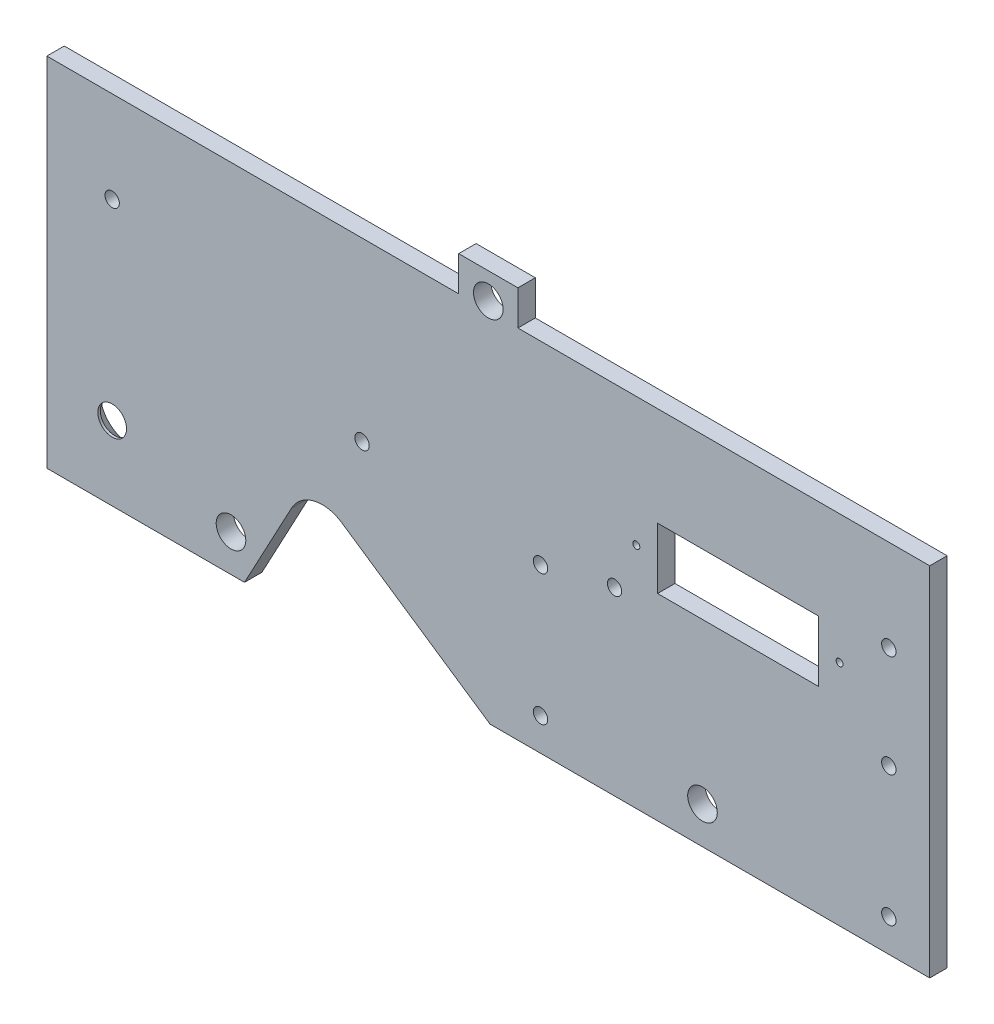
ISO-10303-21;
HEADER;
FILE_DESCRIPTION(('STEP AP214'),'2;1');
FILE_NAME('part.step','',(''),(''),'','','');
FILE_SCHEMA(('AUTOMOTIVE_DESIGN { 1 0 10303 214 1 1 1 1 }'));
ENDSEC;
DATA;
#1=APPLICATION_CONTEXT('core data for automotive mechanical design processes');
#2=APPLICATION_PROTOCOL_DEFINITION('international standard','automotive_design',2000,#1);
#3=PRODUCT_CONTEXT('',#1,'mechanical');
#4=PRODUCT('Part','Part','',(#3));
#5=PRODUCT_RELATED_PRODUCT_CATEGORY('part','',(#4));
#6=PRODUCT_DEFINITION_FORMATION('','',#4);
#7=PRODUCT_DEFINITION_CONTEXT('part definition',#1,'design');
#8=PRODUCT_DEFINITION('design','',#6,#7);
#9=PRODUCT_DEFINITION_SHAPE('','',#8);
#10=(LENGTH_UNIT() NAMED_UNIT(*) SI_UNIT(.MILLI.,.METRE.));
#11=(NAMED_UNIT(*) PLANE_ANGLE_UNIT() SI_UNIT($,.RADIAN.));
#12=(NAMED_UNIT(*) SI_UNIT($,.STERADIAN.) SOLID_ANGLE_UNIT());
#13=UNCERTAINTY_MEASURE_WITH_UNIT(LENGTH_MEASURE(1.E-05),#10,'distance_accuracy_value','');
#14=(GEOMETRIC_REPRESENTATION_CONTEXT(3) GLOBAL_UNCERTAINTY_ASSIGNED_CONTEXT((#13)) GLOBAL_UNIT_ASSIGNED_CONTEXT((#10,
#11,#12)) REPRESENTATION_CONTEXT('',''));
#15=CARTESIAN_POINT('',(0.,0.,0.));
#16=DIRECTION('',(0.,0.,1.));
#17=DIRECTION('',(1.,0.,0.));
#18=AXIS2_PLACEMENT_3D('',#15,#16,#17);
#19=CARTESIAN_POINT('',(-101.4,-41.,-4.));
#20=DIRECTION('',(0.,0.,1.));
#21=DIRECTION('',(1.,0.,0.));
#22=AXIS2_PLACEMENT_3D('',#19,#20,#21);
#23=PLANE('',#22);
#24=CARTESIAN_POINT('',(-86.4,-24.,-4.));
#25=DIRECTION('',(0.,0.,-1.));
#26=DIRECTION('',(-1.,0.,0.));
#27=AXIS2_PLACEMENT_3D('',#24,#25,#26);
#28=CIRCLE('',#27,6.72);
#29=CARTESIAN_POINT('',(-93.12,-24.,-4.));
#30=VERTEX_POINT('',#29);
#31=EDGE_CURVE('E262',#30,#30,#28,.T.);
#32=ORIENTED_EDGE('',*,*,#31,.F.);
#33=EDGE_LOOP('',(#32));
#34=FACE_BOUND('',#33,.T.);
#35=DIRECTION('',(-1.,0.,0.));
#36=VECTOR('',#35,1.);
#37=CARTESIAN_POINT('',(75.8845778593409,18.2267991929112,-4.));
#38=LINE('',#37,#36);
#39=CARTESIAN_POINT('',(75.8845778593409,18.2267991929112,-4.));
#40=VERTEX_POINT('',#39);
#41=CARTESIAN_POINT('',(38.8845778593409,18.2267991929112,-4.));
#42=VERTEX_POINT('',#41);
#43=EDGE_CURVE('E312',#40,#42,#38,.T.);
#44=ORIENTED_EDGE('',*,*,#43,.T.);
#45=DIRECTION('',(0.,-1.,0.));
#46=VECTOR('',#45,1.);
#47=CARTESIAN_POINT('',(38.8845778593409,4.22679919291115,-4.));
#48=LINE('',#47,#46);
#49=CARTESIAN_POINT('',(38.8845778593409,4.22679919291115,-4.));
#50=VERTEX_POINT('',#49);
#51=EDGE_CURVE('E299',#42,#50,#48,.T.);
#52=ORIENTED_EDGE('',*,*,#51,.T.);
#53=DIRECTION('',(1.,0.,0.));
#54=VECTOR('',#53,1.);
#55=CARTESIAN_POINT('',(75.8845778593409,4.22679919291116,-4.));
#56=LINE('',#55,#54);
#57=CARTESIAN_POINT('',(75.8845778593409,4.22679919291115,-4.));
#58=VERTEX_POINT('',#57);
#59=EDGE_CURVE('E303',#50,#58,#56,.T.);
#60=ORIENTED_EDGE('',*,*,#59,.T.);
#61=DIRECTION('',(0.,1.,0.));
#62=VECTOR('',#61,1.);
#63=CARTESIAN_POINT('',(75.8845778593409,4.22679919291116,-4.));
#64=LINE('',#63,#62);
#65=EDGE_CURVE('E308',#58,#40,#64,.T.);
#66=ORIENTED_EDGE('',*,*,#65,.T.);
#67=EDGE_LOOP('',(#44,#52,#60,#66));
#68=FACE_BOUND('',#67,.T.);
#69=CARTESIAN_POINT('',(34.,11.4,-4.));
#70=DIRECTION('',(0.,0.,1.));
#71=DIRECTION('',(1.,0.,0.));
#72=AXIS2_PLACEMENT_3D('',#69,#70,#71);
#73=CIRCLE('',#72,0.800000000000002);
#74=CARTESIAN_POINT('',(34.8,11.4,-4.));
#75=VERTEX_POINT('',#74);
#76=EDGE_CURVE('E345',#75,#75,#73,.T.);
#77=ORIENTED_EDGE('',*,*,#76,.T.);
#78=EDGE_LOOP('',(#77));
#79=FACE_BOUND('',#78,.T.);
#80=CARTESIAN_POINT('',(80.7,11.4,-4.));
#81=DIRECTION('',(0.,0.,1.));
#82=DIRECTION('',(1.,0.,0.));
#83=AXIS2_PLACEMENT_3D('',#80,#81,#82);
#84=CIRCLE('',#83,0.799999999999995);
#85=CARTESIAN_POINT('',(81.5,11.4,-4.));
#86=VERTEX_POINT('',#85);
#87=EDGE_CURVE('E353',#86,#86,#84,.T.);
#88=ORIENTED_EDGE('',*,*,#87,.T.);
#89=EDGE_LOOP('',(#88));
#90=FACE_BOUND('',#89,.T.);
#91=CARTESIAN_POINT('',(-59.1,-32.5,-4.));
#92=DIRECTION('',(0.,0.,1.));
#93=DIRECTION('',(1.,0.,0.));
#94=AXIS2_PLACEMENT_3D('',#91,#92,#93);
#95=CIRCLE('',#94,3.4);
#96=CARTESIAN_POINT('',(-55.7,-32.5,-4.));
#97=VERTEX_POINT('',#96);
#98=EDGE_CURVE('E361',#97,#97,#95,.T.);
#99=ORIENTED_EDGE('',*,*,#98,.T.);
#100=EDGE_LOOP('',(#99));
#101=FACE_BOUND('',#100,.T.);
#102=CARTESIAN_POINT('',(49.2,-32.5,-4.));
#103=DIRECTION('',(0.,0.,1.));
#104=DIRECTION('',(1.,0.,0.));
#105=AXIS2_PLACEMENT_3D('',#102,#103,#104);
#106=CIRCLE('',#105,3.4);
#107=CARTESIAN_POINT('',(52.6,-32.5,-4.));
#108=VERTEX_POINT('',#107);
#109=EDGE_CURVE('E369',#108,#108,#106,.T.);
#110=ORIENTED_EDGE('',*,*,#109,.T.);
#111=EDGE_LOOP('',(#110));
#112=FACE_BOUND('',#111,.T.);
#113=CARTESIAN_POINT('',(0.,43.,-4.));
#114=DIRECTION('',(0.,0.,1.));
#115=DIRECTION('',(1.,0.,0.));
#116=AXIS2_PLACEMENT_3D('',#113,#114,#115);
#117=CIRCLE('',#116,3.4);
#118=CARTESIAN_POINT('',(3.4,43.,-4.));
#119=VERTEX_POINT('',#118);
#120=EDGE_CURVE('E377',#119,#119,#117,.T.);
#121=ORIENTED_EDGE('',*,*,#120,.T.);
#122=EDGE_LOOP('',(#121));
#123=FACE_BOUND('',#122,.T.);
#124=CARTESIAN_POINT('',(12.,-3.5,-4.));
#125=DIRECTION('',(0.,0.,1.));
#126=DIRECTION('',(1.,0.,0.));
#127=AXIS2_PLACEMENT_3D('',#124,#125,#126);
#128=CIRCLE('',#127,1.65);
#129=CARTESIAN_POINT('',(13.65,-3.5,-4.));
#130=VERTEX_POINT('',#129);
#131=EDGE_CURVE('E258',#130,#130,#128,.T.);
#132=ORIENTED_EDGE('',*,*,#131,.T.);
#133=EDGE_LOOP('',(#132));
#134=FACE_BOUND('',#133,.T.);
#135=CARTESIAN_POINT('',(92.,-3.5,-4.));
#136=DIRECTION('',(0.,0.,1.));
#137=DIRECTION('',(1.,0.,0.));
#138=AXIS2_PLACEMENT_3D('',#135,#136,#137);
#139=CIRCLE('',#138,1.65);
#140=CARTESIAN_POINT('',(93.65,-3.5,-4.));
#141=VERTEX_POINT('',#140);
#142=EDGE_CURVE('E250',#141,#141,#139,.T.);
#143=ORIENTED_EDGE('',*,*,#142,.T.);
#144=EDGE_LOOP('',(#143));
#145=FACE_BOUND('',#144,.T.);
#146=CARTESIAN_POINT('',(12.,-33.5,-4.));
#147=DIRECTION('',(0.,0.,1.));
#148=DIRECTION('',(1.,0.,0.));
#149=AXIS2_PLACEMENT_3D('',#146,#147,#148);
#150=CIRCLE('',#149,1.65);
#151=CARTESIAN_POINT('',(13.65,-33.5,-4.));
#152=VERTEX_POINT('',#151);
#153=EDGE_CURVE('E242',#152,#152,#150,.T.);
#154=ORIENTED_EDGE('',*,*,#153,.T.);
#155=EDGE_LOOP('',(#154));
#156=FACE_BOUND('',#155,.T.);
#157=CARTESIAN_POINT('',(92.,-33.5,-4.));
#158=DIRECTION('',(0.,0.,1.));
#159=DIRECTION('',(1.,0.,0.));
#160=AXIS2_PLACEMENT_3D('',#157,#158,#159);
#161=CIRCLE('',#160,1.65);
#162=CARTESIAN_POINT('',(93.65,-33.5,-4.));
#163=VERTEX_POINT('',#162);
#164=EDGE_CURVE('E234',#163,#163,#161,.T.);
#165=ORIENTED_EDGE('',*,*,#164,.T.);
#166=EDGE_LOOP('',(#165));
#167=FACE_BOUND('',#166,.T.);
#168=CARTESIAN_POINT('',(-29.,0.5,-4.));
#169=DIRECTION('',(0.,0.,1.));
#170=DIRECTION('',(1.,0.,0.));
#171=AXIS2_PLACEMENT_3D('',#168,#169,#170);
#172=CIRCLE('',#171,1.65);
#173=CARTESIAN_POINT('',(-27.35,0.5,-4.));
#174=VERTEX_POINT('',#173);
#175=EDGE_CURVE('E226',#174,#174,#172,.T.);
#176=ORIENTED_EDGE('',*,*,#175,.T.);
#177=EDGE_LOOP('',(#176));
#178=FACE_BOUND('',#177,.T.);
#179=CARTESIAN_POINT('',(-86.4,20.,-4.));
#180=DIRECTION('',(0.,0.,1.));
#181=DIRECTION('',(1.,0.,0.));
#182=AXIS2_PLACEMENT_3D('',#179,#180,#181);
#183=CIRCLE('',#182,1.65);
#184=CARTESIAN_POINT('',(-84.75,20.,-4.));
#185=VERTEX_POINT('',#184);
#186=EDGE_CURVE('E218',#185,#185,#183,.T.);
#187=ORIENTED_EDGE('',*,*,#186,.T.);
#188=EDGE_LOOP('',(#187));
#189=FACE_BOUND('',#188,.T.);
#190=CARTESIAN_POINT('',(92.,20.,-4.));
#191=DIRECTION('',(0.,0.,1.));
#192=DIRECTION('',(1.,0.,0.));
#193=AXIS2_PLACEMENT_3D('',#190,#191,#192);
#194=CIRCLE('',#193,1.65);
#195=CARTESIAN_POINT('',(93.65,20.,-4.));
#196=VERTEX_POINT('',#195);
#197=EDGE_CURVE('E210',#196,#196,#194,.T.);
#198=ORIENTED_EDGE('',*,*,#197,.T.);
#199=EDGE_LOOP('',(#198));
#200=FACE_BOUND('',#199,.T.);
#201=CARTESIAN_POINT('',(29.,0.5,-4.));
#202=DIRECTION('',(0.,0.,1.));
#203=DIRECTION('',(1.,0.,0.));
#204=AXIS2_PLACEMENT_3D('',#201,#202,#203);
#205=CIRCLE('',#204,1.65);
#206=CARTESIAN_POINT('',(30.65,0.5,-4.));
#207=VERTEX_POINT('',#206);
#208=EDGE_CURVE('E202',#207,#207,#205,.T.);
#209=ORIENTED_EDGE('',*,*,#208,.T.);
#210=EDGE_LOOP('',(#209));
#211=FACE_BOUND('',#210,.T.);
#212=DIRECTION('',(0.,1.,0.));
#213=VECTOR('',#212,1.);
#214=CARTESIAN_POINT('',(6.80000000000001,-41.,-4.));
#215=LINE('',#214,#213);
#216=CARTESIAN_POINT('',(6.8,41.,-4.));
#217=VERTEX_POINT('',#216);
#218=CARTESIAN_POINT('',(6.8,49.,-4.));
#219=VERTEX_POINT('',#218);
#220=EDGE_CURVE('E161',#217,#219,#215,.T.);
#221=ORIENTED_EDGE('',*,*,#220,.F.);
#222=DIRECTION('',(-1.,0.,0.));
#223=VECTOR('',#222,1.);
#224=CARTESIAN_POINT('',(-101.4,41.,-4.));
#225=LINE('',#224,#223);
#226=CARTESIAN_POINT('',(101.4,41.,-4.));
#227=VERTEX_POINT('',#226);
#228=EDGE_CURVE('E162',#227,#217,#225,.T.);
#229=ORIENTED_EDGE('',*,*,#228,.F.);
#230=DIRECTION('',(0.,1.,0.));
#231=VECTOR('',#230,1.);
#232=CARTESIAN_POINT('',(101.4,49.,-4.));
#233=LINE('',#232,#231);
#234=CARTESIAN_POINT('',(101.4,-41.,-4.));
#235=VERTEX_POINT('',#234);
#236=EDGE_CURVE('E391',#235,#227,#233,.T.);
#237=ORIENTED_EDGE('',*,*,#236,.F.);
#238=DIRECTION('',(1.,0.,0.));
#239=VECTOR('',#238,1.);
#240=CARTESIAN_POINT('',(-101.4,-41.,-4.));
#241=LINE('',#240,#239);
#242=CARTESIAN_POINT('',(0.400000000000005,-41.,-4.));
#243=VERTEX_POINT('',#242);
#244=EDGE_CURVE('E385',#243,#235,#241,.T.);
#245=ORIENTED_EDGE('',*,*,#244,.F.);
#246=DIRECTION('',(-0.828338030888977,0.560228619924912,0.));
#247=VECTOR('',#246,1.);
#248=CARTESIAN_POINT('',(-69.4494483498535,6.24117279700235,-4.));
#249=LINE('',#248,#247);
#250=CARTESIAN_POINT('',(-33.6541024444562,-17.9682398926383,-4.));
#251=VERTEX_POINT('',#250);
#252=EDGE_CURVE('E289',#243,#251,#249,.T.);
#253=ORIENTED_EDGE('',*,*,#252,.T.);
#254=CARTESIAN_POINT('',(-38.1359314038555,-24.5949441397501,-4.));
#255=DIRECTION('',(0.,0.,1.));
#256=DIRECTION('',(1.,0.,0.));
#257=AXIS2_PLACEMENT_3D('',#254,#255,#256);
#258=CIRCLE('',#257,8.);
#259=CARTESIAN_POINT('',(-45.1877711640858,-20.8171728396268,-4.));
#260=VERTEX_POINT('',#259);
#261=EDGE_CURVE('E292',#251,#260,#258,.T.);
#262=ORIENTED_EDGE('',*,*,#261,.T.);
#263=DIRECTION('',(-0.472221412515419,-0.881479970028782,0.));
#264=VECTOR('',#263,1.);
#265=CARTESIAN_POINT('',(-66.1238850346878,-59.8979187314172,-4.));
#266=LINE('',#265,#264);
#267=CARTESIAN_POINT('',(-56.,-41.,-4.));
#268=VERTEX_POINT('',#267);
#269=EDGE_CURVE('E295',#260,#268,#266,.T.);
#270=ORIENTED_EDGE('',*,*,#269,.T.);
#271=CARTESIAN_POINT('',(-101.4,-41.,-4.));
#272=VERTEX_POINT('',#271);
#273=EDGE_CURVE('E387',#272,#268,#241,.T.);
#274=ORIENTED_EDGE('',*,*,#273,.F.);
#275=DIRECTION('',(0.,-1.,0.));
#276=VECTOR('',#275,1.);
#277=CARTESIAN_POINT('',(-101.4,49.,-4.));
#278=LINE('',#277,#276);
#279=CARTESIAN_POINT('',(-101.4,41.,-4.));
#280=VERTEX_POINT('',#279);
#281=EDGE_CURVE('E382',#280,#272,#278,.T.);
#282=ORIENTED_EDGE('',*,*,#281,.F.);
#283=DIRECTION('',(1.,0.,0.));
#284=VECTOR('',#283,1.);
#285=CARTESIAN_POINT('',(-101.4,41.,-4.));
#286=LINE('',#285,#284);
#287=CARTESIAN_POINT('',(-6.8,41.,-4.));
#288=VERTEX_POINT('',#287);
#289=EDGE_CURVE('E61',#280,#288,#286,.T.);
#290=ORIENTED_EDGE('',*,*,#289,.T.);
#291=DIRECTION('',(0.,1.,0.));
#292=VECTOR('',#291,1.);
#293=CARTESIAN_POINT('',(-6.79999999999999,-41.,-4.));
#294=LINE('',#293,#292);
#295=CARTESIAN_POINT('',(-6.8,49.,-4.));
#296=VERTEX_POINT('',#295);
#297=EDGE_CURVE('E189',#288,#296,#294,.T.);
#298=ORIENTED_EDGE('',*,*,#297,.T.);
#299=DIRECTION('',(-1.,0.,0.));
#300=VECTOR('',#299,1.);
#301=CARTESIAN_POINT('',(-101.4,49.,-4.));
#302=LINE('',#301,#300);
#303=EDGE_CURVE('E395',#219,#296,#302,.T.);
#304=ORIENTED_EDGE('',*,*,#303,.F.);
#305=EDGE_LOOP('',(#221,#229,#237,#245,#253,#262,#270,#274,#282,#290,#298,#304));
#306=FACE_BOUND('',#305,.T.);
#307=ADVANCED_FACE('F37',(#34,#68,#79,#90,#101,#112,#123,#134,#145,#156,#167,#178,#189,#200,
#211,#306),#23,.F.);
#308=CARTESIAN_POINT('',(-101.4,-41.,0.));
#309=DIRECTION('',(0.,0.,1.));
#310=DIRECTION('',(1.,0.,0.));
#311=AXIS2_PLACEMENT_3D('',#308,#309,#310);
#312=PLANE('',#311);
#313=CARTESIAN_POINT('',(-86.4,-24.,0.));
#314=DIRECTION('',(0.,0.,-1.));
#315=DIRECTION('',(-1.,0.,0.));
#316=AXIS2_PLACEMENT_3D('',#313,#314,#315);
#317=CIRCLE('',#316,3.3);
#318=CARTESIAN_POINT('',(-89.7,-24.,0.));
#319=VERTEX_POINT('',#318);
#320=EDGE_CURVE('E270',#319,#319,#317,.T.);
#321=ORIENTED_EDGE('',*,*,#320,.T.);
#322=EDGE_LOOP('',(#321));
#323=FACE_BOUND('',#322,.T.);
#324=DIRECTION('',(0.,-1.,0.));
#325=VECTOR('',#324,1.);
#326=CARTESIAN_POINT('',(38.8845778593409,4.22679919291115,0.));
#327=LINE('',#326,#325);
#328=CARTESIAN_POINT('',(38.8845778593409,18.2267991929112,0.));
#329=VERTEX_POINT('',#328);
#330=CARTESIAN_POINT('',(38.8845778593409,4.22679919291115,0.));
#331=VERTEX_POINT('',#330);
#332=EDGE_CURVE('E298',#329,#331,#327,.T.);
#333=ORIENTED_EDGE('',*,*,#332,.F.);
#334=DIRECTION('',(-1.,0.,0.));
#335=VECTOR('',#334,1.);
#336=CARTESIAN_POINT('',(75.8845778593409,18.2267991929112,0.));
#337=LINE('',#336,#335);
#338=CARTESIAN_POINT('',(75.8845778593409,18.2267991929112,0.));
#339=VERTEX_POINT('',#338);
#340=EDGE_CURVE('E304',#339,#329,#337,.T.);
#341=ORIENTED_EDGE('',*,*,#340,.F.);
#342=DIRECTION('',(0.,1.,0.));
#343=VECTOR('',#342,1.);
#344=CARTESIAN_POINT('',(75.8845778593409,4.22679919291116,0.));
#345=LINE('',#344,#343);
#346=CARTESIAN_POINT('',(75.8845778593409,4.22679919291116,0.));
#347=VERTEX_POINT('',#346);
#348=EDGE_CURVE('E322',#347,#339,#345,.T.);
#349=ORIENTED_EDGE('',*,*,#348,.F.);
#350=DIRECTION('',(1.,0.,0.));
#351=VECTOR('',#350,1.);
#352=CARTESIAN_POINT('',(75.8845778593409,4.22679919291116,0.));
#353=LINE('',#352,#351);
#354=EDGE_CURVE('E318',#331,#347,#353,.T.);
#355=ORIENTED_EDGE('',*,*,#354,.F.);
#356=EDGE_LOOP('',(#333,#341,#349,#355));
#357=FACE_BOUND('',#356,.T.);
#358=CARTESIAN_POINT('',(34.,11.4,0.));
#359=DIRECTION('',(0.,0.,1.));
#360=DIRECTION('',(1.,0.,0.));
#361=AXIS2_PLACEMENT_3D('',#358,#359,#360);
#362=CIRCLE('',#361,0.799999999999995);
#363=CARTESIAN_POINT('',(34.8,11.4,0.));
#364=VERTEX_POINT('',#363);
#365=EDGE_CURVE('E332',#364,#364,#362,.T.);
#366=ORIENTED_EDGE('',*,*,#365,.F.);
#367=EDGE_LOOP('',(#366));
#368=FACE_BOUND('',#367,.T.);
#369=CARTESIAN_POINT('',(80.7,11.4,0.));
#370=DIRECTION('',(0.,0.,1.));
#371=DIRECTION('',(1.,0.,0.));
#372=AXIS2_PLACEMENT_3D('',#369,#370,#371);
#373=CIRCLE('',#372,0.799999999999995);
#374=CARTESIAN_POINT('',(81.5,11.4,0.));
#375=VERTEX_POINT('',#374);
#376=EDGE_CURVE('E349',#375,#375,#373,.T.);
#377=ORIENTED_EDGE('',*,*,#376,.F.);
#378=EDGE_LOOP('',(#377));
#379=FACE_BOUND('',#378,.T.);
#380=CARTESIAN_POINT('',(-59.1,-32.5,0.));
#381=DIRECTION('',(0.,0.,1.));
#382=DIRECTION('',(1.,0.,0.));
#383=AXIS2_PLACEMENT_3D('',#380,#381,#382);
#384=CIRCLE('',#383,3.39999999999999);
#385=CARTESIAN_POINT('',(-55.7,-32.5,0.));
#386=VERTEX_POINT('',#385);
#387=EDGE_CURVE('E357',#386,#386,#384,.T.);
#388=ORIENTED_EDGE('',*,*,#387,.F.);
#389=EDGE_LOOP('',(#388));
#390=FACE_BOUND('',#389,.T.);
#391=CARTESIAN_POINT('',(49.2,-32.5,0.));
#392=DIRECTION('',(0.,0.,1.));
#393=DIRECTION('',(1.,0.,0.));
#394=AXIS2_PLACEMENT_3D('',#391,#392,#393);
#395=CIRCLE('',#394,3.39999999999999);
#396=CARTESIAN_POINT('',(52.6,-32.5,0.));
#397=VERTEX_POINT('',#396);
#398=EDGE_CURVE('E365',#397,#397,#395,.T.);
#399=ORIENTED_EDGE('',*,*,#398,.F.);
#400=EDGE_LOOP('',(#399));
#401=FACE_BOUND('',#400,.T.);
#402=CARTESIAN_POINT('',(0.,43.,0.));
#403=DIRECTION('',(0.,0.,1.));
#404=DIRECTION('',(1.,0.,0.));
#405=AXIS2_PLACEMENT_3D('',#402,#403,#404);
#406=CIRCLE('',#405,3.4);
#407=CARTESIAN_POINT('',(3.4,43.,0.));
#408=VERTEX_POINT('',#407);
#409=EDGE_CURVE('E373',#408,#408,#406,.T.);
#410=ORIENTED_EDGE('',*,*,#409,.F.);
#411=EDGE_LOOP('',(#410));
#412=FACE_BOUND('',#411,.T.);
#413=CARTESIAN_POINT('',(12.,-3.5,0.));
#414=DIRECTION('',(0.,0.,1.));
#415=DIRECTION('',(1.,0.,0.));
#416=AXIS2_PLACEMENT_3D('',#413,#414,#415);
#417=CIRCLE('',#416,1.64999999999999);
#418=CARTESIAN_POINT('',(13.65,-3.5,0.));
#419=VERTEX_POINT('',#418);
#420=EDGE_CURVE('E254',#419,#419,#417,.T.);
#421=ORIENTED_EDGE('',*,*,#420,.F.);
#422=EDGE_LOOP('',(#421));
#423=FACE_BOUND('',#422,.T.);
#424=CARTESIAN_POINT('',(92.,-3.5,0.));
#425=DIRECTION('',(0.,0.,1.));
#426=DIRECTION('',(1.,0.,0.));
#427=AXIS2_PLACEMENT_3D('',#424,#425,#426);
#428=CIRCLE('',#427,1.64999999999998);
#429=CARTESIAN_POINT('',(93.65,-3.5,0.));
#430=VERTEX_POINT('',#429);
#431=EDGE_CURVE('E246',#430,#430,#428,.T.);
#432=ORIENTED_EDGE('',*,*,#431,.F.);
#433=EDGE_LOOP('',(#432));
#434=FACE_BOUND('',#433,.T.);
#435=CARTESIAN_POINT('',(12.,-33.5,0.));
#436=DIRECTION('',(0.,0.,1.));
#437=DIRECTION('',(1.,0.,0.));
#438=AXIS2_PLACEMENT_3D('',#435,#436,#437);
#439=CIRCLE('',#438,1.64999999999999);
#440=CARTESIAN_POINT('',(13.65,-33.5,0.));
#441=VERTEX_POINT('',#440);
#442=EDGE_CURVE('E238',#441,#441,#439,.T.);
#443=ORIENTED_EDGE('',*,*,#442,.F.);
#444=EDGE_LOOP('',(#443));
#445=FACE_BOUND('',#444,.T.);
#446=CARTESIAN_POINT('',(92.,-33.5,0.));
#447=DIRECTION('',(0.,0.,1.));
#448=DIRECTION('',(1.,0.,0.));
#449=AXIS2_PLACEMENT_3D('',#446,#447,#448);
#450=CIRCLE('',#449,1.64999999999998);
#451=CARTESIAN_POINT('',(93.65,-33.5,0.));
#452=VERTEX_POINT('',#451);
#453=EDGE_CURVE('E230',#452,#452,#450,.T.);
#454=ORIENTED_EDGE('',*,*,#453,.F.);
#455=EDGE_LOOP('',(#454));
#456=FACE_BOUND('',#455,.T.);
#457=CARTESIAN_POINT('',(-29.,0.5,0.));
#458=DIRECTION('',(0.,0.,1.));
#459=DIRECTION('',(1.,0.,0.));
#460=AXIS2_PLACEMENT_3D('',#457,#458,#459);
#461=CIRCLE('',#460,1.65);
#462=CARTESIAN_POINT('',(-27.35,0.5,0.));
#463=VERTEX_POINT('',#462);
#464=EDGE_CURVE('E222',#463,#463,#461,.T.);
#465=ORIENTED_EDGE('',*,*,#464,.F.);
#466=EDGE_LOOP('',(#465));
#467=FACE_BOUND('',#466,.T.);
#468=CARTESIAN_POINT('',(-86.4,20.,0.));
#469=DIRECTION('',(0.,0.,1.));
#470=DIRECTION('',(1.,0.,0.));
#471=AXIS2_PLACEMENT_3D('',#468,#469,#470);
#472=CIRCLE('',#471,1.65);
#473=CARTESIAN_POINT('',(-84.75,20.,0.));
#474=VERTEX_POINT('',#473);
#475=EDGE_CURVE('E214',#474,#474,#472,.T.);
#476=ORIENTED_EDGE('',*,*,#475,.F.);
#477=EDGE_LOOP('',(#476));
#478=FACE_BOUND('',#477,.T.);
#479=CARTESIAN_POINT('',(92.,20.,0.));
#480=DIRECTION('',(0.,0.,1.));
#481=DIRECTION('',(1.,0.,0.));
#482=AXIS2_PLACEMENT_3D('',#479,#480,#481);
#483=CIRCLE('',#482,1.65);
#484=CARTESIAN_POINT('',(93.65,20.,0.));
#485=VERTEX_POINT('',#484);
#486=EDGE_CURVE('E206',#485,#485,#483,.T.);
#487=ORIENTED_EDGE('',*,*,#486,.F.);
#488=EDGE_LOOP('',(#487));
#489=FACE_BOUND('',#488,.T.);
#490=CARTESIAN_POINT('',(29.,0.5,0.));
#491=DIRECTION('',(0.,0.,1.));
#492=DIRECTION('',(1.,0.,0.));
#493=AXIS2_PLACEMENT_3D('',#490,#491,#492);
#494=CIRCLE('',#493,1.64999999999999);
#495=CARTESIAN_POINT('',(30.65,0.5,0.));
#496=VERTEX_POINT('',#495);
#497=EDGE_CURVE('E198',#496,#496,#494,.T.);
#498=ORIENTED_EDGE('',*,*,#497,.F.);
#499=EDGE_LOOP('',(#498));
#500=FACE_BOUND('',#499,.T.);
#501=DIRECTION('',(-1.,0.,0.));
#502=VECTOR('',#501,1.);
#503=CARTESIAN_POINT('',(-101.4,41.,0.));
#504=LINE('',#503,#502);
#505=CARTESIAN_POINT('',(101.4,41.,0.));
#506=VERTEX_POINT('',#505);
#507=CARTESIAN_POINT('',(6.8,41.,0.));
#508=VERTEX_POINT('',#507);
#509=EDGE_CURVE('E53',#506,#508,#504,.T.);
#510=ORIENTED_EDGE('',*,*,#509,.T.);
#511=DIRECTION('',(0.,1.,0.));
#512=VECTOR('',#511,1.);
#513=CARTESIAN_POINT('',(6.80000000000001,-41.,0.));
#514=LINE('',#513,#512);
#515=CARTESIAN_POINT('',(6.8,49.,0.));
#516=VERTEX_POINT('',#515);
#517=EDGE_CURVE('E154',#508,#516,#514,.T.);
#518=ORIENTED_EDGE('',*,*,#517,.T.);
#519=DIRECTION('',(-1.,0.,0.));
#520=VECTOR('',#519,1.);
#521=CARTESIAN_POINT('',(-101.4,49.,0.));
#522=LINE('',#521,#520);
#523=CARTESIAN_POINT('',(-6.80000000000003,49.,0.));
#524=VERTEX_POINT('',#523);
#525=EDGE_CURVE('E386',#516,#524,#522,.T.);
#526=ORIENTED_EDGE('',*,*,#525,.T.);
#527=DIRECTION('',(0.,1.,0.));
#528=VECTOR('',#527,1.);
#529=CARTESIAN_POINT('',(-6.79999999999999,-41.,0.));
#530=LINE('',#529,#528);
#531=CARTESIAN_POINT('',(-6.8,41.,0.));
#532=VERTEX_POINT('',#531);
#533=EDGE_CURVE('E185',#532,#524,#530,.T.);
#534=ORIENTED_EDGE('',*,*,#533,.F.);
#535=DIRECTION('',(1.,0.,0.));
#536=VECTOR('',#535,1.);
#537=CARTESIAN_POINT('',(-101.4,41.,0.));
#538=LINE('',#537,#536);
#539=CARTESIAN_POINT('',(-101.4,41.,0.));
#540=VERTEX_POINT('',#539);
#541=EDGE_CURVE('E192',#540,#532,#538,.T.);
#542=ORIENTED_EDGE('',*,*,#541,.F.);
#543=DIRECTION('',(0.,-1.,0.));
#544=VECTOR('',#543,1.);
#545=CARTESIAN_POINT('',(-101.4,49.,0.));
#546=LINE('',#545,#544);
#547=CARTESIAN_POINT('',(-101.4,-41.,0.));
#548=VERTEX_POINT('',#547);
#549=EDGE_CURVE('E381',#540,#548,#546,.T.);
#550=ORIENTED_EDGE('',*,*,#549,.T.);
#551=DIRECTION('',(1.,0.,0.));
#552=VECTOR('',#551,1.);
#553=CARTESIAN_POINT('',(-101.4,-41.,0.));
#554=LINE('',#553,#552);
#555=CARTESIAN_POINT('',(-56.,-41.,0.));
#556=VERTEX_POINT('',#555);
#557=EDGE_CURVE('E402',#548,#556,#554,.T.);
#558=ORIENTED_EDGE('',*,*,#557,.T.);
#559=DIRECTION('',(-0.472221412515419,-0.881479970028782,0.));
#560=VECTOR('',#559,1.);
#561=CARTESIAN_POINT('',(-66.1238850346878,-59.8979187314172,0.));
#562=LINE('',#561,#560);
#563=CARTESIAN_POINT('',(-45.1877711640858,-20.8171728396268,0.));
#564=VERTEX_POINT('',#563);
#565=EDGE_CURVE('E425',#564,#556,#562,.T.);
#566=ORIENTED_EDGE('',*,*,#565,.F.);
#567=CARTESIAN_POINT('',(-38.1359314038555,-24.5949441397501,0.));
#568=DIRECTION('',(0.,0.,1.));
#569=DIRECTION('',(1.,0.,0.));
#570=AXIS2_PLACEMENT_3D('',#567,#568,#569);
#571=CIRCLE('',#570,8.);
#572=CARTESIAN_POINT('',(-33.6541024444562,-17.9682398926383,0.));
#573=VERTEX_POINT('',#572);
#574=EDGE_CURVE('E421',#573,#564,#571,.T.);
#575=ORIENTED_EDGE('',*,*,#574,.F.);
#576=DIRECTION('',(-0.828338030888977,0.560228619924912,0.));
#577=VECTOR('',#576,1.);
#578=CARTESIAN_POINT('',(-69.4494483498535,6.24117279700235,0.));
#579=LINE('',#578,#577);
#580=CARTESIAN_POINT('',(0.400000000000005,-41.,0.));
#581=VERTEX_POINT('',#580);
#582=EDGE_CURVE('E414',#581,#573,#579,.T.);
#583=ORIENTED_EDGE('',*,*,#582,.F.);
#584=CARTESIAN_POINT('',(101.4,-41.,0.));
#585=VERTEX_POINT('',#584);
#586=EDGE_CURVE('E401',#581,#585,#554,.T.);
#587=ORIENTED_EDGE('',*,*,#586,.T.);
#588=DIRECTION('',(0.,1.,0.));
#589=VECTOR('',#588,1.);
#590=CARTESIAN_POINT('',(101.4,49.,0.));
#591=LINE('',#590,#589);
#592=EDGE_CURVE('E171',#585,#506,#591,.T.);
#593=ORIENTED_EDGE('',*,*,#592,.T.);
#594=EDGE_LOOP('',(#510,#518,#526,#534,#542,#550,#558,#566,#575,#583,#587,#593));
#595=FACE_BOUND('',#594,.T.);
#596=ADVANCED_FACE('F169',(#323,#357,#368,#379,#390,#401,#412,#423,#434,#445,#456,#467,#478,
#489,#500,#595),#312,.T.);
#597=CARTESIAN_POINT('',(-101.4,49.,-4.));
#598=DIRECTION('',(0.,1.,0.));
#599=DIRECTION('',(0.,0.,1.));
#600=AXIS2_PLACEMENT_3D('',#597,#598,#599);
#601=PLANE('',#600);
#602=ORIENTED_EDGE('',*,*,#525,.F.);
#603=DIRECTION('',(0.,0.,-1.));
#604=VECTOR('',#603,1.);
#605=CARTESIAN_POINT('',(6.8,49.,-4.));
#606=LINE('',#605,#604);
#607=EDGE_CURVE('E11',#516,#219,#606,.T.);
#608=ORIENTED_EDGE('',*,*,#607,.T.);
#609=ORIENTED_EDGE('',*,*,#303,.T.);
#610=DIRECTION('',(0.,0.,-1.));
#611=VECTOR('',#610,1.);
#612=CARTESIAN_POINT('',(-6.8,49.,-4.));
#613=LINE('',#612,#611);
#614=EDGE_CURVE('E429',#524,#296,#613,.T.);
#615=ORIENTED_EDGE('',*,*,#614,.F.);
#616=EDGE_LOOP('',(#602,#608,#609,#615));
#617=FACE_BOUND('',#616,.T.);
#618=ADVANCED_FACE('F443',(#617),#601,.T.);
#619=CARTESIAN_POINT('',(101.4,49.,-4.));
#620=DIRECTION('',(1.,0.,0.));
#621=DIRECTION('',(0.,1.,0.));
#622=AXIS2_PLACEMENT_3D('',#619,#620,#621);
#623=PLANE('',#622);
#624=ORIENTED_EDGE('',*,*,#236,.T.);
#625=DIRECTION('',(0.,0.,1.));
#626=VECTOR('',#625,1.);
#627=CARTESIAN_POINT('',(101.4,41.,-4.));
#628=LINE('',#627,#626);
#629=EDGE_CURVE('E46',#227,#506,#628,.T.);
#630=ORIENTED_EDGE('',*,*,#629,.T.);
#631=ORIENTED_EDGE('',*,*,#592,.F.);
#632=DIRECTION('',(0.,0.,1.));
#633=VECTOR('',#632,1.);
#634=CARTESIAN_POINT('',(101.4,-41.,-4.));
#635=LINE('',#634,#633);
#636=EDGE_CURVE('E410',#235,#585,#635,.T.);
#637=ORIENTED_EDGE('',*,*,#636,.F.);
#638=EDGE_LOOP('',(#624,#630,#631,#637));
#639=FACE_BOUND('',#638,.T.);
#640=ADVANCED_FACE('F437',(#639),#623,.T.);
#641=CARTESIAN_POINT('',(-101.4,-41.,-4.));
#642=DIRECTION('',(0.,-1.,0.));
#643=DIRECTION('',(0.,0.,-1.));
#644=AXIS2_PLACEMENT_3D('',#641,#642,#643);
#645=PLANE('',#644);
#646=DIRECTION('',(0.,0.,-1.));
#647=VECTOR('',#646,1.);
#648=CARTESIAN_POINT('',(-56.,-41.,277.386913894654));
#649=LINE('',#648,#647);
#650=EDGE_CURVE('E285',#556,#268,#649,.T.);
#651=ORIENTED_EDGE('',*,*,#650,.F.);
#652=ORIENTED_EDGE('',*,*,#557,.F.);
#653=DIRECTION('',(0.,0.,1.));
#654=VECTOR('',#653,1.);
#655=CARTESIAN_POINT('',(-101.4,-41.,-4.));
#656=LINE('',#655,#654);
#657=EDGE_CURVE('E398',#272,#548,#656,.T.);
#658=ORIENTED_EDGE('',*,*,#657,.F.);
#659=ORIENTED_EDGE('',*,*,#273,.T.);
#660=EDGE_LOOP('',(#651,#652,#658,#659));
#661=FACE_BOUND('',#660,.T.);
#662=ADVANCED_FACE('F478',(#661),#645,.T.);
#663=CARTESIAN_POINT('',(-101.4,49.,-4.));
#664=DIRECTION('',(-1.,0.,0.));
#665=DIRECTION('',(0.,-1.,0.));
#666=AXIS2_PLACEMENT_3D('',#663,#664,#665);
#667=PLANE('',#666);
#668=DIRECTION('',(0.,0.,1.));
#669=VECTOR('',#668,1.);
#670=CARTESIAN_POINT('',(-101.4,41.,-4.));
#671=LINE('',#670,#669);
#672=EDGE_CURVE('E432',#280,#540,#671,.T.);
#673=ORIENTED_EDGE('',*,*,#672,.F.);
#674=ORIENTED_EDGE('',*,*,#281,.T.);
#675=ORIENTED_EDGE('',*,*,#657,.T.);
#676=ORIENTED_EDGE('',*,*,#549,.F.);
#677=EDGE_LOOP('',(#673,#674,#675,#676));
#678=FACE_BOUND('',#677,.T.);
#679=ADVANCED_FACE('F39',(#678),#667,.T.);
#680=DIRECTION('',(0.,0.,-1.));
#681=VECTOR('',#680,1.);
#682=CARTESIAN_POINT('',(0.399999999999998,-41.,277.386913894654));
#683=LINE('',#682,#681);
#684=EDGE_CURVE('E275',#581,#243,#683,.T.);
#685=ORIENTED_EDGE('',*,*,#684,.T.);
#686=ORIENTED_EDGE('',*,*,#244,.T.);
#687=ORIENTED_EDGE('',*,*,#636,.T.);
#688=ORIENTED_EDGE('',*,*,#586,.F.);
#689=EDGE_LOOP('',(#685,#686,#687,#688));
#690=FACE_BOUND('',#689,.T.);
#691=ADVANCED_FACE('F479',(#690),#645,.T.);
#692=CARTESIAN_POINT('',(0.,43.,0.));
#693=DIRECTION('',(0.,0.,1.));
#694=DIRECTION('',(1.,0.,0.));
#695=AXIS2_PLACEMENT_3D('',#692,#693,#694);
#696=CYLINDRICAL_SURFACE('',#695,3.4);
#697=ORIENTED_EDGE('',*,*,#120,.F.);
#698=EDGE_LOOP('',(#697));
#699=FACE_BOUND('',#698,.T.);
#700=ORIENTED_EDGE('',*,*,#409,.T.);
#701=EDGE_LOOP('',(#700));
#702=FACE_BOUND('',#701,.T.);
#703=ADVANCED_FACE('F472',(#699,#702),#696,.F.);
#704=CARTESIAN_POINT('',(49.2,-32.5,0.));
#705=DIRECTION('',(0.,0.,1.));
#706=DIRECTION('',(1.,0.,0.));
#707=AXIS2_PLACEMENT_3D('',#704,#705,#706);
#708=CYLINDRICAL_SURFACE('',#707,3.39999999999999);
#709=ORIENTED_EDGE('',*,*,#109,.F.);
#710=EDGE_LOOP('',(#709));
#711=FACE_BOUND('',#710,.T.);
#712=ORIENTED_EDGE('',*,*,#398,.T.);
#713=EDGE_LOOP('',(#712));
#714=FACE_BOUND('',#713,.T.);
#715=ADVANCED_FACE('F486',(#711,#714),#708,.F.);
#716=CARTESIAN_POINT('',(-59.1,-32.5,0.));
#717=DIRECTION('',(0.,0.,1.));
#718=DIRECTION('',(1.,0.,0.));
#719=AXIS2_PLACEMENT_3D('',#716,#717,#718);
#720=CYLINDRICAL_SURFACE('',#719,3.39999999999999);
#721=ORIENTED_EDGE('',*,*,#98,.F.);
#722=EDGE_LOOP('',(#721));
#723=FACE_BOUND('',#722,.T.);
#724=ORIENTED_EDGE('',*,*,#387,.T.);
#725=EDGE_LOOP('',(#724));
#726=FACE_BOUND('',#725,.T.);
#727=ADVANCED_FACE('F549',(#723,#726),#720,.F.);
#728=CARTESIAN_POINT('',(80.7,11.4,0.));
#729=DIRECTION('',(0.,0.,1.));
#730=DIRECTION('',(1.,0.,0.));
#731=AXIS2_PLACEMENT_3D('',#728,#729,#730);
#732=CYLINDRICAL_SURFACE('',#731,0.799999999999995);
#733=ORIENTED_EDGE('',*,*,#87,.F.);
#734=EDGE_LOOP('',(#733));
#735=FACE_BOUND('',#734,.T.);
#736=ORIENTED_EDGE('',*,*,#376,.T.);
#737=EDGE_LOOP('',(#736));
#738=FACE_BOUND('',#737,.T.);
#739=ADVANCED_FACE('F545',(#735,#738),#732,.F.);
#740=CARTESIAN_POINT('',(34.,11.4,0.));
#741=DIRECTION('',(0.,0.,1.));
#742=DIRECTION('',(1.,0.,0.));
#743=AXIS2_PLACEMENT_3D('',#740,#741,#742);
#744=CYLINDRICAL_SURFACE('',#743,0.799999999999999);
#745=ORIENTED_EDGE('',*,*,#76,.F.);
#746=EDGE_LOOP('',(#745));
#747=FACE_BOUND('',#746,.T.);
#748=ORIENTED_EDGE('',*,*,#365,.T.);
#749=EDGE_LOOP('',(#748));
#750=FACE_BOUND('',#749,.T.);
#751=ADVANCED_FACE('F541',(#747,#750),#744,.F.);
#752=CARTESIAN_POINT('',(38.8845778593409,4.22679919291115,-4.));
#753=DIRECTION('',(-1.,0.,0.));
#754=DIRECTION('',(0.,0.,1.));
#755=AXIS2_PLACEMENT_3D('',#752,#753,#754);
#756=PLANE('',#755);
#757=ORIENTED_EDGE('',*,*,#332,.T.);
#758=DIRECTION('',(0.,0.,1.));
#759=VECTOR('',#758,1.);
#760=CARTESIAN_POINT('',(38.8845778593409,4.22679919291115,-4.));
#761=LINE('',#760,#759);
#762=EDGE_CURVE('E316',#50,#331,#761,.T.);
#763=ORIENTED_EDGE('',*,*,#762,.F.);
#764=ORIENTED_EDGE('',*,*,#51,.F.);
#765=DIRECTION('',(0.,0.,1.));
#766=VECTOR('',#765,1.);
#767=CARTESIAN_POINT('',(38.8845778593409,18.2267991929112,-4.));
#768=LINE('',#767,#766);
#769=EDGE_CURVE('E329',#42,#329,#768,.T.);
#770=ORIENTED_EDGE('',*,*,#769,.T.);
#771=EDGE_LOOP('',(#757,#763,#764,#770));
#772=FACE_BOUND('',#771,.T.);
#773=ADVANCED_FACE('F531',(#772),#756,.F.);
#774=CARTESIAN_POINT('',(75.8845778593409,18.2267991929112,-4.));
#775=DIRECTION('',(0.,1.,0.));
#776=DIRECTION('',(-1.,0.,0.));
#777=AXIS2_PLACEMENT_3D('',#774,#775,#776);
#778=PLANE('',#777);
#779=ORIENTED_EDGE('',*,*,#340,.T.);
#780=ORIENTED_EDGE('',*,*,#769,.F.);
#781=ORIENTED_EDGE('',*,*,#43,.F.);
#782=DIRECTION('',(0.,0.,1.));
#783=VECTOR('',#782,1.);
#784=CARTESIAN_POINT('',(75.8845778593409,18.2267991929112,-4.));
#785=LINE('',#784,#783);
#786=EDGE_CURVE('E333',#40,#339,#785,.T.);
#787=ORIENTED_EDGE('',*,*,#786,.T.);
#788=EDGE_LOOP('',(#779,#780,#781,#787));
#789=FACE_BOUND('',#788,.T.);
#790=ADVANCED_FACE('F527',(#789),#778,.F.);
#791=CARTESIAN_POINT('',(75.8845778593409,4.22679919291116,-4.));
#792=DIRECTION('',(1.,0.,0.));
#793=DIRECTION('',(0.,0.,-1.));
#794=AXIS2_PLACEMENT_3D('',#791,#792,#793);
#795=PLANE('',#794);
#796=ORIENTED_EDGE('',*,*,#348,.T.);
#797=ORIENTED_EDGE('',*,*,#786,.F.);
#798=ORIENTED_EDGE('',*,*,#65,.F.);
#799=DIRECTION('',(0.,0.,1.));
#800=VECTOR('',#799,1.);
#801=CARTESIAN_POINT('',(75.8845778593409,4.22679919291116,-4.));
#802=LINE('',#801,#800);
#803=EDGE_CURVE('E336',#58,#347,#802,.T.);
#804=ORIENTED_EDGE('',*,*,#803,.T.);
#805=EDGE_LOOP('',(#796,#797,#798,#804));
#806=FACE_BOUND('',#805,.T.);
#807=ADVANCED_FACE('F530',(#806),#795,.F.);
#808=CARTESIAN_POINT('',(75.8845778593409,4.22679919291116,-4.));
#809=DIRECTION('',(0.,-1.,0.));
#810=DIRECTION('',(1.,0.,0.));
#811=AXIS2_PLACEMENT_3D('',#808,#809,#810);
#812=PLANE('',#811);
#813=ORIENTED_EDGE('',*,*,#354,.T.);
#814=ORIENTED_EDGE('',*,*,#803,.F.);
#815=ORIENTED_EDGE('',*,*,#59,.F.);
#816=ORIENTED_EDGE('',*,*,#762,.T.);
#817=EDGE_LOOP('',(#813,#814,#815,#816));
#818=FACE_BOUND('',#817,.T.);
#819=ADVANCED_FACE('F526',(#818),#812,.F.);
#820=CARTESIAN_POINT('',(-56.,-41.,277.386913894654));
#821=DIRECTION('',(-0.881479970028782,0.472221412515419,0.));
#822=DIRECTION('',(-0.472221412515419,-0.881479970028782,0.));
#823=AXIS2_PLACEMENT_3D('',#820,#821,#822);
#824=PLANE('',#823);
#825=ORIENTED_EDGE('',*,*,#269,.F.);
#826=DIRECTION('',(0.,0.,-1.));
#827=VECTOR('',#826,1.);
#828=CARTESIAN_POINT('',(-45.1877711640858,-20.8171728396268,277.386913894654));
#829=LINE('',#828,#827);
#830=EDGE_CURVE('E278',#564,#260,#829,.T.);
#831=ORIENTED_EDGE('',*,*,#830,.F.);
#832=ORIENTED_EDGE('',*,*,#565,.T.);
#833=ORIENTED_EDGE('',*,*,#650,.T.);
#834=EDGE_LOOP('',(#825,#831,#832,#833));
#835=FACE_BOUND('',#834,.T.);
#836=ADVANCED_FACE('F499',(#835),#824,.F.);
#837=CARTESIAN_POINT('',(-38.1359314038555,-24.5949441397501,277.386913894654));
#838=DIRECTION('',(0.,0.,-1.));
#839=DIRECTION('',(-1.,0.,0.));
#840=AXIS2_PLACEMENT_3D('',#837,#838,#839);
#841=CYLINDRICAL_SURFACE('',#840,8.);
#842=ORIENTED_EDGE('',*,*,#261,.F.);
#843=DIRECTION('',(0.,0.,-1.));
#844=VECTOR('',#843,1.);
#845=CARTESIAN_POINT('',(-33.6541024444562,-17.9682398926383,277.386913894654));
#846=LINE('',#845,#844);
#847=EDGE_CURVE('E274',#573,#251,#846,.T.);
#848=ORIENTED_EDGE('',*,*,#847,.F.);
#849=ORIENTED_EDGE('',*,*,#574,.T.);
#850=ORIENTED_EDGE('',*,*,#830,.T.);
#851=EDGE_LOOP('',(#842,#848,#849,#850));
#852=FACE_BOUND('',#851,.T.);
#853=ADVANCED_FACE('F502',(#852),#841,.F.);
#854=CARTESIAN_POINT('',(-33.6541024444562,-17.9682398926383,277.386913894654));
#855=DIRECTION('',(0.560228619924912,0.828338030888977,0.));
#856=DIRECTION('',(-0.828338030888977,0.560228619924912,0.));
#857=AXIS2_PLACEMENT_3D('',#854,#855,#856);
#858=PLANE('',#857);
#859=ORIENTED_EDGE('',*,*,#252,.F.);
#860=ORIENTED_EDGE('',*,*,#684,.F.);
#861=ORIENTED_EDGE('',*,*,#582,.T.);
#862=ORIENTED_EDGE('',*,*,#847,.T.);
#863=EDGE_LOOP('',(#859,#860,#861,#862));
#864=FACE_BOUND('',#863,.T.);
#865=ADVANCED_FACE('F508',(#864),#858,.F.);
#866=CARTESIAN_POINT('',(-86.4,-24.,-4.));
#867=DIRECTION('',(0.,0.,-1.));
#868=DIRECTION('',(-1.,0.,0.));
#869=AXIS2_PLACEMENT_3D('',#866,#867,#868);
#870=CYLINDRICAL_SURFACE('',#869,3.3);
#871=ORIENTED_EDGE('',*,*,#320,.F.);
#872=EDGE_LOOP('',(#871));
#873=FACE_BOUND('',#872,.T.);
#874=CARTESIAN_POINT('',(-86.4,-24.,-0.580000000000003));
#875=DIRECTION('',(0.,0.,-1.));
#876=DIRECTION('',(-1.,0.,0.));
#877=AXIS2_PLACEMENT_3D('',#874,#875,#876);
#878=CIRCLE('',#877,3.3);
#879=CARTESIAN_POINT('',(-89.7,-24.,-0.580000000000003));
#880=VERTEX_POINT('',#879);
#881=EDGE_CURVE('E266',#880,#880,#878,.T.);
#882=ORIENTED_EDGE('',*,*,#881,.T.);
#883=EDGE_LOOP('',(#882));
#884=FACE_BOUND('',#883,.T.);
#885=ADVANCED_FACE('F512',(#873,#884),#870,.F.);
#886=CARTESIAN_POINT('',(-86.4,-24.,-4.));
#887=DIRECTION('',(0.,0.,-1.));
#888=DIRECTION('',(-1.,0.,0.));
#889=AXIS2_PLACEMENT_3D('',#886,#887,#888);
#890=CONICAL_SURFACE('',#889,6.72,0.78539816339745);
#891=ORIENTED_EDGE('',*,*,#881,.F.);
#892=EDGE_LOOP('',(#891));
#893=FACE_BOUND('',#892,.T.);
#894=ORIENTED_EDGE('',*,*,#31,.T.);
#895=EDGE_LOOP('',(#894));
#896=FACE_BOUND('',#895,.T.);
#897=ADVANCED_FACE('F518',(#893,#896),#890,.F.);
#898=CARTESIAN_POINT('',(12.,-3.5,0.));
#899=DIRECTION('',(0.,0.,1.));
#900=DIRECTION('',(1.,0.,0.));
#901=AXIS2_PLACEMENT_3D('',#898,#899,#900);
#902=CYLINDRICAL_SURFACE('',#901,1.64999999999999);
#903=ORIENTED_EDGE('',*,*,#131,.F.);
#904=EDGE_LOOP('',(#903));
#905=FACE_BOUND('',#904,.T.);
#906=ORIENTED_EDGE('',*,*,#420,.T.);
#907=EDGE_LOOP('',(#906));
#908=FACE_BOUND('',#907,.T.);
#909=ADVANCED_FACE('F609',(#905,#908),#902,.F.);
#910=CARTESIAN_POINT('',(92.,-3.5,0.));
#911=DIRECTION('',(0.,0.,1.));
#912=DIRECTION('',(1.,0.,0.));
#913=AXIS2_PLACEMENT_3D('',#910,#911,#912);
#914=CYLINDRICAL_SURFACE('',#913,1.64999999999999);
#915=ORIENTED_EDGE('',*,*,#142,.F.);
#916=EDGE_LOOP('',(#915));
#917=FACE_BOUND('',#916,.T.);
#918=ORIENTED_EDGE('',*,*,#431,.T.);
#919=EDGE_LOOP('',(#918));
#920=FACE_BOUND('',#919,.T.);
#921=ADVANCED_FACE('F605',(#917,#920),#914,.F.);
#922=CARTESIAN_POINT('',(12.,-33.5,0.));
#923=DIRECTION('',(0.,0.,1.));
#924=DIRECTION('',(1.,0.,0.));
#925=AXIS2_PLACEMENT_3D('',#922,#923,#924);
#926=CYLINDRICAL_SURFACE('',#925,1.64999999999999);
#927=ORIENTED_EDGE('',*,*,#153,.F.);
#928=EDGE_LOOP('',(#927));
#929=FACE_BOUND('',#928,.T.);
#930=ORIENTED_EDGE('',*,*,#442,.T.);
#931=EDGE_LOOP('',(#930));
#932=FACE_BOUND('',#931,.T.);
#933=ADVANCED_FACE('F601',(#929,#932),#926,.F.);
#934=CARTESIAN_POINT('',(92.,-33.5,0.));
#935=DIRECTION('',(0.,0.,1.));
#936=DIRECTION('',(1.,0.,0.));
#937=AXIS2_PLACEMENT_3D('',#934,#935,#936);
#938=CYLINDRICAL_SURFACE('',#937,1.64999999999999);
#939=ORIENTED_EDGE('',*,*,#164,.F.);
#940=EDGE_LOOP('',(#939));
#941=FACE_BOUND('',#940,.T.);
#942=ORIENTED_EDGE('',*,*,#453,.T.);
#943=EDGE_LOOP('',(#942));
#944=FACE_BOUND('',#943,.T.);
#945=ADVANCED_FACE('F597',(#941,#944),#938,.F.);
#946=CARTESIAN_POINT('',(-29.,0.5,0.));
#947=DIRECTION('',(0.,0.,1.));
#948=DIRECTION('',(1.,0.,0.));
#949=AXIS2_PLACEMENT_3D('',#946,#947,#948);
#950=CYLINDRICAL_SURFACE('',#949,1.65);
#951=ORIENTED_EDGE('',*,*,#175,.F.);
#952=EDGE_LOOP('',(#951));
#953=FACE_BOUND('',#952,.T.);
#954=ORIENTED_EDGE('',*,*,#464,.T.);
#955=EDGE_LOOP('',(#954));
#956=FACE_BOUND('',#955,.T.);
#957=ADVANCED_FACE('F593',(#953,#956),#950,.F.);
#958=CARTESIAN_POINT('',(-86.4,20.,0.));
#959=DIRECTION('',(0.,0.,1.));
#960=DIRECTION('',(1.,0.,0.));
#961=AXIS2_PLACEMENT_3D('',#958,#959,#960);
#962=CYLINDRICAL_SURFACE('',#961,1.65);
#963=ORIENTED_EDGE('',*,*,#186,.F.);
#964=EDGE_LOOP('',(#963));
#965=FACE_BOUND('',#964,.T.);
#966=ORIENTED_EDGE('',*,*,#475,.T.);
#967=EDGE_LOOP('',(#966));
#968=FACE_BOUND('',#967,.T.);
#969=ADVANCED_FACE('F586',(#965,#968),#962,.F.);
#970=CARTESIAN_POINT('',(92.,20.,0.));
#971=DIRECTION('',(0.,0.,1.));
#972=DIRECTION('',(1.,0.,0.));
#973=AXIS2_PLACEMENT_3D('',#970,#971,#972);
#974=CYLINDRICAL_SURFACE('',#973,1.65);
#975=ORIENTED_EDGE('',*,*,#197,.F.);
#976=EDGE_LOOP('',(#975));
#977=FACE_BOUND('',#976,.T.);
#978=ORIENTED_EDGE('',*,*,#486,.T.);
#979=EDGE_LOOP('',(#978));
#980=FACE_BOUND('',#979,.T.);
#981=ADVANCED_FACE('F581',(#977,#980),#974,.F.);
#982=CARTESIAN_POINT('',(29.,0.5,0.));
#983=DIRECTION('',(0.,0.,1.));
#984=DIRECTION('',(1.,0.,0.));
#985=AXIS2_PLACEMENT_3D('',#982,#983,#984);
#986=CYLINDRICAL_SURFACE('',#985,1.64999999999999);
#987=ORIENTED_EDGE('',*,*,#208,.F.);
#988=EDGE_LOOP('',(#987));
#989=FACE_BOUND('',#988,.T.);
#990=ORIENTED_EDGE('',*,*,#497,.T.);
#991=EDGE_LOOP('',(#990));
#992=FACE_BOUND('',#991,.T.);
#993=ADVANCED_FACE('F458',(#989,#992),#986,.F.);
#994=CARTESIAN_POINT('',(-6.8,41.,282.386913894654));
#995=DIRECTION('',(0.,-1.,0.));
#996=DIRECTION('',(0.,0.,-1.));
#997=AXIS2_PLACEMENT_3D('',#994,#995,#996);
#998=PLANE('',#997);
#999=ORIENTED_EDGE('',*,*,#289,.F.);
#1000=ORIENTED_EDGE('',*,*,#672,.T.);
#1001=ORIENTED_EDGE('',*,*,#541,.T.);
#1002=DIRECTION('',(0.,0.,-1.));
#1003=VECTOR('',#1002,1.);
#1004=CARTESIAN_POINT('',(-6.8,41.,282.386913894654));
#1005=LINE('',#1004,#1003);
#1006=EDGE_CURVE('E181',#532,#288,#1005,.T.);
#1007=ORIENTED_EDGE('',*,*,#1006,.T.);
#1008=EDGE_LOOP('',(#999,#1000,#1001,#1007));
#1009=FACE_BOUND('',#1008,.T.);
#1010=ADVANCED_FACE('F449',(#1009),#998,.F.);
#1011=CARTESIAN_POINT('',(-6.8,49.,282.386913894654));
#1012=DIRECTION('',(1.,0.,0.));
#1013=DIRECTION('',(0.,1.,0.));
#1014=AXIS2_PLACEMENT_3D('',#1011,#1012,#1013);
#1015=PLANE('',#1014);
#1016=ORIENTED_EDGE('',*,*,#297,.F.);
#1017=ORIENTED_EDGE('',*,*,#1006,.F.);
#1018=ORIENTED_EDGE('',*,*,#533,.T.);
#1019=ORIENTED_EDGE('',*,*,#614,.T.);
#1020=EDGE_LOOP('',(#1016,#1017,#1018,#1019));
#1021=FACE_BOUND('',#1020,.T.);
#1022=ADVANCED_FACE('F450',(#1021),#1015,.F.);
#1023=CARTESIAN_POINT('',(6.8,49.,282.386913894654));
#1024=DIRECTION('',(1.,0.,0.));
#1025=DIRECTION('',(0.,1.,0.));
#1026=AXIS2_PLACEMENT_3D('',#1023,#1024,#1025);
#1027=PLANE('',#1026);
#1028=DIRECTION('',(0.,0.,-1.));
#1029=VECTOR('',#1028,1.);
#1030=CARTESIAN_POINT('',(6.8,41.,282.386913894654));
#1031=LINE('',#1030,#1029);
#1032=EDGE_CURVE('E156',#508,#217,#1031,.T.);
#1033=ORIENTED_EDGE('',*,*,#1032,.T.);
#1034=ORIENTED_EDGE('',*,*,#220,.T.);
#1035=ORIENTED_EDGE('',*,*,#607,.F.);
#1036=ORIENTED_EDGE('',*,*,#517,.F.);
#1037=EDGE_LOOP('',(#1033,#1034,#1035,#1036));
#1038=FACE_BOUND('',#1037,.T.);
#1039=ADVANCED_FACE('F155',(#1038),#1027,.T.);
#1040=CARTESIAN_POINT('',(6.8,41.,282.386913894654));
#1041=DIRECTION('',(0.,1.,0.));
#1042=DIRECTION('',(0.,0.,1.));
#1043=AXIS2_PLACEMENT_3D('',#1040,#1041,#1042);
#1044=PLANE('',#1043);
#1045=ORIENTED_EDGE('',*,*,#629,.F.);
#1046=ORIENTED_EDGE('',*,*,#228,.T.);
#1047=ORIENTED_EDGE('',*,*,#1032,.F.);
#1048=ORIENTED_EDGE('',*,*,#509,.F.);
#1049=EDGE_LOOP('',(#1045,#1046,#1047,#1048));
#1050=FACE_BOUND('',#1049,.T.);
#1051=ADVANCED_FACE('F164',(#1050),#1044,.T.);
#1052=CLOSED_SHELL('',(#307,#596,#618,#640,#662,#679,#691,#703,#715,#727,#739,#751,#773,#790,
#807,#819,#836,#853,#865,#885,#897,#909,#921,#933,#945,#957,#969,#981,#993,#1010,#1022,#1039,#1051));
#1053=MANIFOLD_SOLID_BREP('B2',#1052);
#1054=ADVANCED_BREP_SHAPE_REPRESENTATION('',(#18,#1053),#14);
#1055=SHAPE_DEFINITION_REPRESENTATION(#9,#1054);
ENDSEC;
END-ISO-10303-21;
